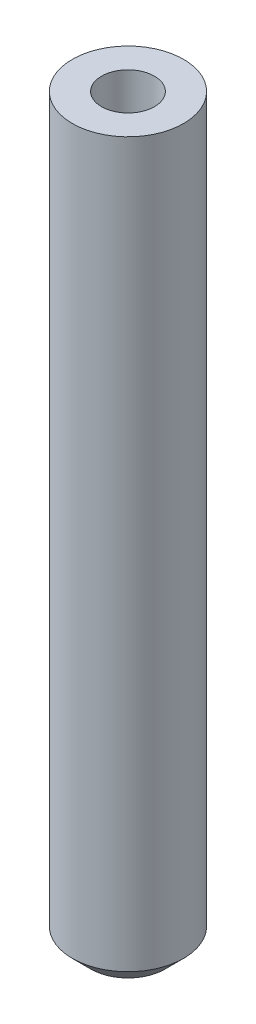
ISO-10303-21;
HEADER;
FILE_DESCRIPTION(('STEP AP214'),'2;1');
FILE_NAME('part.step','',(''),(''),'','','');
FILE_SCHEMA(('AUTOMOTIVE_DESIGN { 1 0 10303 214 1 1 1 1 }'));
ENDSEC;
DATA;
#1=APPLICATION_CONTEXT('core data for automotive mechanical design processes');
#2=APPLICATION_PROTOCOL_DEFINITION('international standard','automotive_design',2000,#1);
#3=PRODUCT_CONTEXT('',#1,'mechanical');
#4=PRODUCT('Part','Part','',(#3));
#5=PRODUCT_RELATED_PRODUCT_CATEGORY('part','',(#4));
#6=PRODUCT_DEFINITION_FORMATION('','',#4);
#7=PRODUCT_DEFINITION_CONTEXT('part definition',#1,'design');
#8=PRODUCT_DEFINITION('design','',#6,#7);
#9=PRODUCT_DEFINITION_SHAPE('','',#8);
#10=(LENGTH_UNIT() NAMED_UNIT(*) SI_UNIT(.MILLI.,.METRE.));
#11=(NAMED_UNIT(*) PLANE_ANGLE_UNIT() SI_UNIT($,.RADIAN.));
#12=(NAMED_UNIT(*) SI_UNIT($,.STERADIAN.) SOLID_ANGLE_UNIT());
#13=UNCERTAINTY_MEASURE_WITH_UNIT(LENGTH_MEASURE(1.E-05),#10,'distance_accuracy_value','');
#14=(GEOMETRIC_REPRESENTATION_CONTEXT(3) GLOBAL_UNCERTAINTY_ASSIGNED_CONTEXT((#13)) GLOBAL_UNIT_ASSIGNED_CONTEXT((#10,
#11,#12)) REPRESENTATION_CONTEXT('',''));
#15=CARTESIAN_POINT('',(0.,0.,0.));
#16=DIRECTION('',(0.,0.,1.));
#17=DIRECTION('',(1.,0.,0.));
#18=AXIS2_PLACEMENT_3D('',#15,#16,#17);
#19=CARTESIAN_POINT('',(0.,40.,0.));
#20=DIRECTION('',(0.,-1.,0.));
#21=DIRECTION('',(0.,0.,-1.));
#22=AXIS2_PLACEMENT_3D('',#19,#20,#21);
#23=CYLINDRICAL_SURFACE('',#22,3.);
#24=CARTESIAN_POINT('',(0.,1.00000000000001,0.));
#25=DIRECTION('',(0.,1.,0.));
#26=DIRECTION('',(0.,0.,1.));
#27=AXIS2_PLACEMENT_3D('',#24,#25,#26);
#28=CIRCLE('',#27,3.);
#29=CARTESIAN_POINT('',(0.,1.00000000000001,3.));
#30=VERTEX_POINT('',#29);
#31=EDGE_CURVE('E45',#30,#30,#28,.T.);
#32=ORIENTED_EDGE('',*,*,#31,.T.);
#33=EDGE_LOOP('',(#32));
#34=FACE_BOUND('',#33,.T.);
#35=CARTESIAN_POINT('',(0.,40.,0.));
#36=DIRECTION('',(0.,1.,0.));
#37=DIRECTION('',(0.,0.,1.));
#38=AXIS2_PLACEMENT_3D('',#35,#36,#37);
#39=CIRCLE('',#38,3.);
#40=CARTESIAN_POINT('',(0.,40.,3.));
#41=VERTEX_POINT('',#40);
#42=EDGE_CURVE('E50',#41,#41,#39,.T.);
#43=ORIENTED_EDGE('',*,*,#42,.F.);
#44=EDGE_LOOP('',(#43));
#45=FACE_BOUND('',#44,.T.);
#46=ADVANCED_FACE('F37',(#34,#45),#23,.T.);
#47=CARTESIAN_POINT('',(0.,40.,0.));
#48=DIRECTION('',(0.,1.,0.));
#49=DIRECTION('',(0.,0.,1.));
#50=AXIS2_PLACEMENT_3D('',#47,#48,#49);
#51=PLANE('',#50);
#52=CARTESIAN_POINT('',(0.,40.,0.));
#53=DIRECTION('',(0.,-1.,0.));
#54=DIRECTION('',(0.,0.,-1.));
#55=AXIS2_PLACEMENT_3D('',#52,#53,#54);
#56=CIRCLE('',#55,1.4276638823232);
#57=CARTESIAN_POINT('',(0.,40.,-1.4276638823232));
#58=VERTEX_POINT('',#57);
#59=EDGE_CURVE('E55',#58,#58,#56,.T.);
#60=ORIENTED_EDGE('',*,*,#59,.T.);
#61=EDGE_LOOP('',(#60));
#62=FACE_BOUND('',#61,.T.);
#63=ORIENTED_EDGE('',*,*,#42,.T.);
#64=EDGE_LOOP('',(#63));
#65=FACE_BOUND('',#64,.T.);
#66=ADVANCED_FACE('F66',(#62,#65),#51,.T.);
#67=CARTESIAN_POINT('',(0.,0.,0.));
#68=DIRECTION('',(0.,1.,0.));
#69=DIRECTION('',(0.,0.,1.));
#70=AXIS2_PLACEMENT_3D('',#67,#68,#69);
#71=PLANE('',#70);
#72=CARTESIAN_POINT('',(0.,0.,0.));
#73=DIRECTION('',(0.,1.,0.));
#74=DIRECTION('',(0.,0.,1.));
#75=AXIS2_PLACEMENT_3D('',#72,#73,#74);
#76=CIRCLE('',#75,1.99999999999999);
#77=CARTESIAN_POINT('',(0.,0.,1.99999999999999));
#78=VERTEX_POINT('',#77);
#79=EDGE_CURVE('E10',#78,#78,#76,.F.);
#80=ORIENTED_EDGE('',*,*,#79,.T.);
#81=EDGE_LOOP('',(#80));
#82=FACE_BOUND('',#81,.T.);
#83=CARTESIAN_POINT('',(0.,0.,0.));
#84=DIRECTION('',(0.,-1.,0.));
#85=DIRECTION('',(0.,0.,-1.));
#86=AXIS2_PLACEMENT_3D('',#83,#84,#85);
#87=CIRCLE('',#86,1.4276638823232);
#88=CARTESIAN_POINT('',(0.,0.,-1.4276638823232));
#89=VERTEX_POINT('',#88);
#90=EDGE_CURVE('E58',#89,#89,#87,.T.);
#91=ORIENTED_EDGE('',*,*,#90,.F.);
#92=EDGE_LOOP('',(#91));
#93=FACE_BOUND('',#92,.T.);
#94=ADVANCED_FACE('F72',(#82,#93),#71,.F.);
#95=CARTESIAN_POINT('',(0.,40.,0.));
#96=DIRECTION('',(0.,-1.,0.));
#97=DIRECTION('',(0.,0.,-1.));
#98=AXIS2_PLACEMENT_3D('',#95,#96,#97);
#99=CYLINDRICAL_SURFACE('',#98,1.4276638823232);
#100=ORIENTED_EDGE('',*,*,#59,.F.);
#101=EDGE_LOOP('',(#100));
#102=FACE_BOUND('',#101,.T.);
#103=ORIENTED_EDGE('',*,*,#90,.T.);
#104=EDGE_LOOP('',(#103));
#105=FACE_BOUND('',#104,.T.);
#106=ADVANCED_FACE('F69',(#102,#105),#99,.F.);
#107=CARTESIAN_POINT('',(0.,1.00000000000001,0.));
#108=DIRECTION('',(0.,1.,0.));
#109=DIRECTION('',(0.,0.,1.));
#110=AXIS2_PLACEMENT_3D('',#107,#108,#109);
#111=CONICAL_SURFACE('',#110,3.,0.78539816339745);
#112=ORIENTED_EDGE('',*,*,#79,.F.);
#113=EDGE_LOOP('',(#112));
#114=FACE_BOUND('',#113,.T.);
#115=ORIENTED_EDGE('',*,*,#31,.F.);
#116=EDGE_LOOP('',(#115));
#117=FACE_BOUND('',#116,.T.);
#118=ADVANCED_FACE('F39',(#114,#117),#111,.T.);
#119=CLOSED_SHELL('',(#46,#66,#94,#106,#118));
#120=MANIFOLD_SOLID_BREP('B2',#119);
#121=ADVANCED_BREP_SHAPE_REPRESENTATION('',(#18,#120),#14);
#122=SHAPE_DEFINITION_REPRESENTATION(#9,#121);
ENDSEC;
END-ISO-10303-21;
